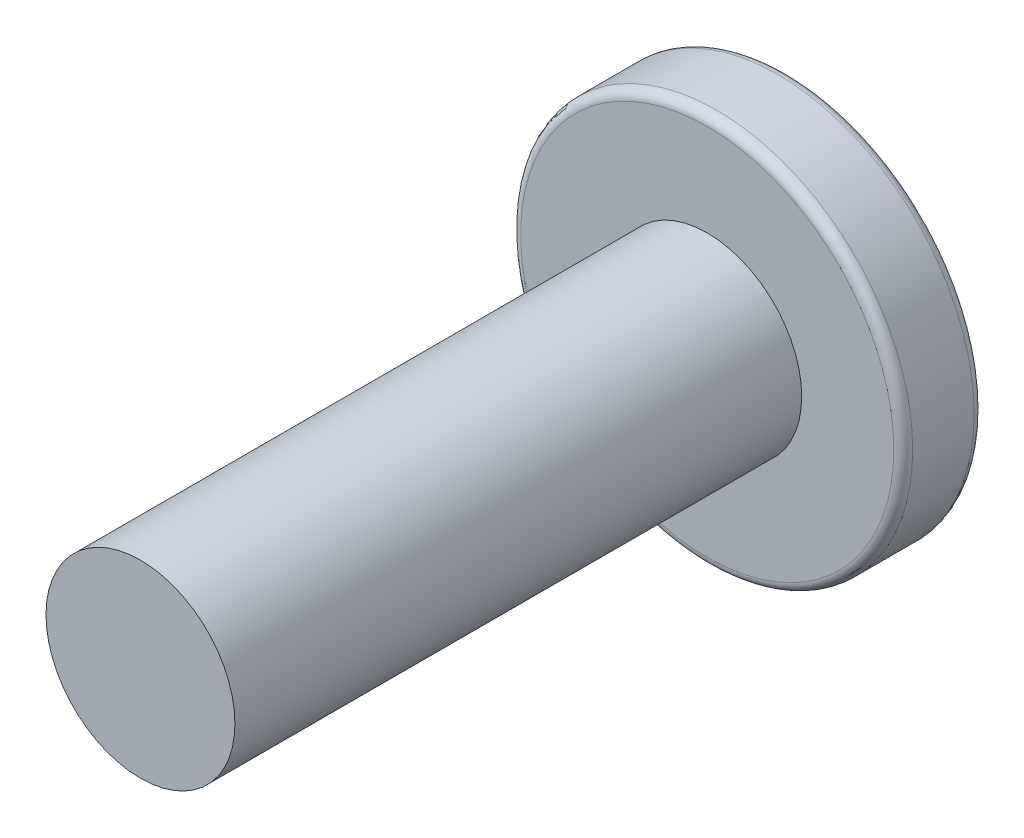
ISO-10303-21;
HEADER;
FILE_DESCRIPTION(('STEP AP214'),'2;1');
FILE_NAME('part.step','',(''),(''),'','','');
FILE_SCHEMA(('AUTOMOTIVE_DESIGN { 1 0 10303 214 1 1 1 1 }'));
ENDSEC;
DATA;
#1=APPLICATION_CONTEXT('core data for automotive mechanical design processes');
#2=APPLICATION_PROTOCOL_DEFINITION('international standard','automotive_design',2000,#1);
#3=PRODUCT_CONTEXT('',#1,'mechanical');
#4=PRODUCT('Part','Part','',(#3));
#5=PRODUCT_RELATED_PRODUCT_CATEGORY('part','',(#4));
#6=PRODUCT_DEFINITION_FORMATION('','',#4);
#7=PRODUCT_DEFINITION_CONTEXT('part definition',#1,'design');
#8=PRODUCT_DEFINITION('design','',#6,#7);
#9=PRODUCT_DEFINITION_SHAPE('','',#8);
#10=(LENGTH_UNIT() NAMED_UNIT(*) SI_UNIT(.MILLI.,.METRE.));
#11=(NAMED_UNIT(*) PLANE_ANGLE_UNIT() SI_UNIT($,.RADIAN.));
#12=(NAMED_UNIT(*) SI_UNIT($,.STERADIAN.) SOLID_ANGLE_UNIT());
#13=UNCERTAINTY_MEASURE_WITH_UNIT(LENGTH_MEASURE(1.E-05),#10,'distance_accuracy_value','');
#14=(GEOMETRIC_REPRESENTATION_CONTEXT(3) GLOBAL_UNCERTAINTY_ASSIGNED_CONTEXT((#13)) GLOBAL_UNIT_ASSIGNED_CONTEXT((#10,
#11,#12)) REPRESENTATION_CONTEXT('',''));
#15=CARTESIAN_POINT('',(0.,0.,0.));
#16=DIRECTION('',(0.,0.,1.));
#17=DIRECTION('',(1.,0.,0.));
#18=AXIS2_PLACEMENT_3D('',#15,#16,#17);
#19=CARTESIAN_POINT('',(0.,0.,1.7));
#20=DIRECTION('',(0.,0.,-1.));
#21=DIRECTION('',(-1.,0.,0.));
#22=AXIS2_PLACEMENT_3D('',#19,#20,#21);
#23=CYLINDRICAL_SURFACE('',#22,4.15);
#24=CARTESIAN_POINT('',(0.,0.,0.2));
#25=DIRECTION('',(0.,0.,1.));
#26=DIRECTION('',(1.,0.,0.));
#27=AXIS2_PLACEMENT_3D('',#24,#25,#26);
#28=CIRCLE('',#27,4.15);
#29=CARTESIAN_POINT('',(4.15,0.,0.2));
#30=VERTEX_POINT('',#29);
#31=EDGE_CURVE('E179',#30,#30,#28,.T.);
#32=ORIENTED_EDGE('',*,*,#31,.T.);
#33=EDGE_LOOP('',(#32));
#34=FACE_BOUND('',#33,.T.);
#35=CARTESIAN_POINT('',(0.,0.,1.5));
#36=DIRECTION('',(0.,0.,1.));
#37=DIRECTION('',(1.,0.,0.));
#38=AXIS2_PLACEMENT_3D('',#35,#36,#37);
#39=CIRCLE('',#38,4.15);
#40=CARTESIAN_POINT('',(4.15,0.,1.5));
#41=VERTEX_POINT('',#40);
#42=EDGE_CURVE('E175',#41,#41,#39,.F.);
#43=ORIENTED_EDGE('',*,*,#42,.T.);
#44=EDGE_LOOP('',(#43));
#45=FACE_BOUND('',#44,.T.);
#46=ADVANCED_FACE('F43',(#34,#45),#23,.T.);
#47=CARTESIAN_POINT('',(0.,0.,1.7));
#48=DIRECTION('',(0.,0.,1.));
#49=DIRECTION('',(1.,0.,0.));
#50=AXIS2_PLACEMENT_3D('',#47,#48,#49);
#51=PLANE('',#50);
#52=CARTESIAN_POINT('',(0.,0.,1.7));
#53=DIRECTION('',(0.,0.,1.));
#54=DIRECTION('',(1.,0.,0.));
#55=AXIS2_PLACEMENT_3D('',#52,#53,#54);
#56=CIRCLE('',#55,3.95);
#57=CARTESIAN_POINT('',(3.95,0.,1.7));
#58=VERTEX_POINT('',#57);
#59=EDGE_CURVE('E11',#58,#58,#56,.T.);
#60=ORIENTED_EDGE('',*,*,#59,.T.);
#61=EDGE_LOOP('',(#60));
#62=FACE_BOUND('',#61,.T.);
#63=CARTESIAN_POINT('',(0.,0.,1.7));
#64=DIRECTION('',(0.,0.,1.));
#65=DIRECTION('',(1.,0.,0.));
#66=AXIS2_PLACEMENT_3D('',#63,#64,#65);
#67=CIRCLE('',#66,2.);
#68=CARTESIAN_POINT('',(2.,0.,1.7));
#69=VERTEX_POINT('',#68);
#70=EDGE_CURVE('E171',#69,#69,#67,.T.);
#71=ORIENTED_EDGE('',*,*,#70,.F.);
#72=EDGE_LOOP('',(#71));
#73=FACE_BOUND('',#72,.T.);
#74=ADVANCED_FACE('F196',(#62,#73),#51,.T.);
#75=CARTESIAN_POINT('',(0.,0.,0.));
#76=DIRECTION('',(0.,0.,1.));
#77=DIRECTION('',(1.,0.,0.));
#78=AXIS2_PLACEMENT_3D('',#75,#76,#77);
#79=PLANE('',#78);
#80=DIRECTION('',(0.5,0.866025403784438,0.));
#81=VECTOR('',#80,1.);
#82=CARTESIAN_POINT('',(-1.15470053837925,0.,0.));
#83=LINE('',#82,#81);
#84=CARTESIAN_POINT('',(-1.15470053837925,0.,0.));
#85=VERTEX_POINT('',#84);
#86=CARTESIAN_POINT('',(-0.577350269189626,1.,0.));
#87=VERTEX_POINT('',#86);
#88=EDGE_CURVE('E139',#85,#87,#83,.T.);
#89=ORIENTED_EDGE('',*,*,#88,.F.);
#90=DIRECTION('',(-0.5,0.866025403784439,0.));
#91=VECTOR('',#90,1.);
#92=CARTESIAN_POINT('',(-0.577350269189626,-1.,0.));
#93=LINE('',#92,#91);
#94=CARTESIAN_POINT('',(-0.577350269189626,-1.,0.));
#95=VERTEX_POINT('',#94);
#96=EDGE_CURVE('E59',#95,#85,#93,.T.);
#97=ORIENTED_EDGE('',*,*,#96,.F.);
#98=DIRECTION('',(-1.,0.,0.));
#99=VECTOR('',#98,1.);
#100=CARTESIAN_POINT('',(0.577350269189626,-1.,0.));
#101=LINE('',#100,#99);
#102=CARTESIAN_POINT('',(0.577350269189626,-1.,0.));
#103=VERTEX_POINT('',#102);
#104=EDGE_CURVE('E152',#103,#95,#101,.T.);
#105=ORIENTED_EDGE('',*,*,#104,.F.);
#106=DIRECTION('',(-0.5,-0.866025403784438,0.));
#107=VECTOR('',#106,1.);
#108=CARTESIAN_POINT('',(1.15470053837925,0.,0.));
#109=LINE('',#108,#107);
#110=CARTESIAN_POINT('',(1.15470053837925,0.,0.));
#111=VERTEX_POINT('',#110);
#112=EDGE_CURVE('E149',#111,#103,#109,.T.);
#113=ORIENTED_EDGE('',*,*,#112,.F.);
#114=DIRECTION('',(0.5,-0.866025403784439,0.));
#115=VECTOR('',#114,1.);
#116=CARTESIAN_POINT('',(0.577350269189626,1.,0.));
#117=LINE('',#116,#115);
#118=CARTESIAN_POINT('',(0.577350269189626,1.,0.));
#119=VERTEX_POINT('',#118);
#120=EDGE_CURVE('E107',#119,#111,#117,.T.);
#121=ORIENTED_EDGE('',*,*,#120,.F.);
#122=DIRECTION('',(1.,0.,0.));
#123=VECTOR('',#122,1.);
#124=CARTESIAN_POINT('',(-0.577350269189626,1.,0.));
#125=LINE('',#124,#123);
#126=EDGE_CURVE('E143',#87,#119,#125,.T.);
#127=ORIENTED_EDGE('',*,*,#126,.F.);
#128=EDGE_LOOP('',(#89,#97,#105,#113,#121,#127));
#129=FACE_BOUND('',#128,.T.);
#130=CARTESIAN_POINT('',(0.,0.,0.));
#131=DIRECTION('',(0.,0.,1.));
#132=DIRECTION('',(1.,0.,0.));
#133=AXIS2_PLACEMENT_3D('',#130,#131,#132);
#134=CIRCLE('',#133,3.95);
#135=CARTESIAN_POINT('',(3.95,0.,0.));
#136=VERTEX_POINT('',#135);
#137=EDGE_CURVE('E52',#136,#136,#134,.F.);
#138=ORIENTED_EDGE('',*,*,#137,.T.);
#139=EDGE_LOOP('',(#138));
#140=FACE_BOUND('',#139,.T.);
#141=ADVANCED_FACE('F186',(#129,#140),#79,.F.);
#142=CARTESIAN_POINT('',(0.,0.,13.7));
#143=DIRECTION('',(0.,0.,-1.));
#144=DIRECTION('',(-1.,0.,0.));
#145=AXIS2_PLACEMENT_3D('',#142,#143,#144);
#146=CYLINDRICAL_SURFACE('',#145,2.);
#147=CARTESIAN_POINT('',(0.,0.,13.7));
#148=DIRECTION('',(0.,0.,1.));
#149=DIRECTION('',(1.,0.,0.));
#150=AXIS2_PLACEMENT_3D('',#147,#148,#149);
#151=CIRCLE('',#150,2.);
#152=CARTESIAN_POINT('',(2.,0.,13.7));
#153=VERTEX_POINT('',#152);
#154=EDGE_CURVE('E158',#153,#153,#151,.T.);
#155=ORIENTED_EDGE('',*,*,#154,.F.);
#156=EDGE_LOOP('',(#155));
#157=FACE_BOUND('',#156,.T.);
#158=ORIENTED_EDGE('',*,*,#70,.T.);
#159=EDGE_LOOP('',(#158));
#160=FACE_BOUND('',#159,.T.);
#161=ADVANCED_FACE('F210',(#157,#160),#146,.T.);
#162=CARTESIAN_POINT('',(0.,0.,13.7));
#163=DIRECTION('',(0.,0.,1.));
#164=DIRECTION('',(1.,0.,0.));
#165=AXIS2_PLACEMENT_3D('',#162,#163,#164);
#166=PLANE('',#165);
#167=ORIENTED_EDGE('',*,*,#154,.T.);
#168=EDGE_LOOP('',(#167));
#169=FACE_BOUND('',#168,.T.);
#170=ADVANCED_FACE('F191',(#169),#166,.T.);
#171=CARTESIAN_POINT('',(0.,0.,0.2));
#172=DIRECTION('',(0.,0.,1.));
#173=DIRECTION('',(1.,0.,0.));
#174=AXIS2_PLACEMENT_3D('',#171,#172,#173);
#175=TOROIDAL_SURFACE('',#174,3.95,0.2);
#176=ORIENTED_EDGE('',*,*,#137,.F.);
#177=EDGE_LOOP('',(#176));
#178=FACE_BOUND('',#177,.T.);
#179=ORIENTED_EDGE('',*,*,#31,.F.);
#180=EDGE_LOOP('',(#179));
#181=FACE_BOUND('',#180,.T.);
#182=ADVANCED_FACE('F188',(#178,#181),#175,.T.);
#183=CARTESIAN_POINT('',(0.,0.,1.5));
#184=DIRECTION('',(0.,0.,1.));
#185=DIRECTION('',(1.,0.,0.));
#186=AXIS2_PLACEMENT_3D('',#183,#184,#185);
#187=TOROIDAL_SURFACE('',#186,3.95,0.2);
#188=ORIENTED_EDGE('',*,*,#42,.F.);
#189=EDGE_LOOP('',(#188));
#190=FACE_BOUND('',#189,.T.);
#191=ORIENTED_EDGE('',*,*,#59,.F.);
#192=EDGE_LOOP('',(#191));
#193=FACE_BOUND('',#192,.T.);
#194=ADVANCED_FACE('F45',(#190,#193),#187,.T.);
#195=CARTESIAN_POINT('',(-0.577350269189626,-1.,1.5));
#196=DIRECTION('',(-0.866025403784439,-0.5,0.));
#197=DIRECTION('',(0.5,-0.866025403784439,0.));
#198=AXIS2_PLACEMENT_3D('',#195,#196,#197);
#199=PLANE('',#198);
#200=ORIENTED_EDGE('',*,*,#96,.T.);
#201=DIRECTION('',(0.,0.,-1.));
#202=VECTOR('',#201,1.);
#203=CARTESIAN_POINT('',(-1.15470053837925,0.,1.5));
#204=LINE('',#203,#202);
#205=CARTESIAN_POINT('',(-1.15470053837925,0.,1.5));
#206=VERTEX_POINT('',#205);
#207=EDGE_CURVE('E89',#206,#85,#204,.T.);
#208=ORIENTED_EDGE('',*,*,#207,.F.);
#209=DIRECTION('',(-0.5,0.866025403784439,0.));
#210=VECTOR('',#209,1.);
#211=CARTESIAN_POINT('',(-0.577350269189626,-1.,1.5));
#212=LINE('',#211,#210);
#213=CARTESIAN_POINT('',(-0.577350269189626,-1.,1.5));
#214=VERTEX_POINT('',#213);
#215=EDGE_CURVE('E155',#214,#206,#212,.T.);
#216=ORIENTED_EDGE('',*,*,#215,.F.);
#217=DIRECTION('',(0.,0.,-1.));
#218=VECTOR('',#217,1.);
#219=CARTESIAN_POINT('',(-0.577350269189626,-1.,1.5));
#220=LINE('',#219,#218);
#221=EDGE_CURVE('E67',#214,#95,#220,.T.);
#222=ORIENTED_EDGE('',*,*,#221,.T.);
#223=EDGE_LOOP('',(#200,#208,#216,#222));
#224=FACE_BOUND('',#223,.T.);
#225=ADVANCED_FACE('F202',(#224),#199,.F.);
#226=CARTESIAN_POINT('',(0.577350269189626,-1.,1.5));
#227=DIRECTION('',(0.,-1.,0.));
#228=DIRECTION('',(0.,0.,-1.));
#229=AXIS2_PLACEMENT_3D('',#226,#227,#228);
#230=PLANE('',#229);
#231=ORIENTED_EDGE('',*,*,#104,.T.);
#232=ORIENTED_EDGE('',*,*,#221,.F.);
#233=DIRECTION('',(-1.,0.,0.));
#234=VECTOR('',#233,1.);
#235=CARTESIAN_POINT('',(0.577350269189626,-1.,1.5));
#236=LINE('',#235,#234);
#237=CARTESIAN_POINT('',(0.577350269189626,-1.,1.5));
#238=VERTEX_POINT('',#237);
#239=EDGE_CURVE('E121',#238,#214,#236,.T.);
#240=ORIENTED_EDGE('',*,*,#239,.F.);
#241=DIRECTION('',(0.,0.,-1.));
#242=VECTOR('',#241,1.);
#243=CARTESIAN_POINT('',(0.577350269189626,-1.,1.5));
#244=LINE('',#243,#242);
#245=EDGE_CURVE('E112',#238,#103,#244,.T.);
#246=ORIENTED_EDGE('',*,*,#245,.T.);
#247=EDGE_LOOP('',(#231,#232,#240,#246));
#248=FACE_BOUND('',#247,.T.);
#249=ADVANCED_FACE('F226',(#248),#230,.F.);
#250=CARTESIAN_POINT('',(1.15470053837925,0.,1.5));
#251=DIRECTION('',(0.866025403784439,-0.5,0.));
#252=DIRECTION('',(0.5,0.866025403784439,0.));
#253=AXIS2_PLACEMENT_3D('',#250,#251,#252);
#254=PLANE('',#253);
#255=ORIENTED_EDGE('',*,*,#112,.T.);
#256=ORIENTED_EDGE('',*,*,#245,.F.);
#257=DIRECTION('',(-0.5,-0.866025403784438,0.));
#258=VECTOR('',#257,1.);
#259=CARTESIAN_POINT('',(1.15470053837925,0.,1.5));
#260=LINE('',#259,#258);
#261=CARTESIAN_POINT('',(1.15470053837925,0.,1.5));
#262=VERTEX_POINT('',#261);
#263=EDGE_CURVE('E116',#262,#238,#260,.T.);
#264=ORIENTED_EDGE('',*,*,#263,.F.);
#265=DIRECTION('',(0.,0.,-1.));
#266=VECTOR('',#265,1.);
#267=CARTESIAN_POINT('',(1.15470053837925,0.,1.5));
#268=LINE('',#267,#266);
#269=EDGE_CURVE('E100',#262,#111,#268,.T.);
#270=ORIENTED_EDGE('',*,*,#269,.T.);
#271=EDGE_LOOP('',(#255,#256,#264,#270));
#272=FACE_BOUND('',#271,.T.);
#273=ADVANCED_FACE('F117',(#272),#254,.F.);
#274=CARTESIAN_POINT('',(0.577350269189626,1.,1.5));
#275=DIRECTION('',(0.866025403784439,0.5,0.));
#276=DIRECTION('',(-0.5,0.866025403784439,0.));
#277=AXIS2_PLACEMENT_3D('',#274,#275,#276);
#278=PLANE('',#277);
#279=ORIENTED_EDGE('',*,*,#120,.T.);
#280=ORIENTED_EDGE('',*,*,#269,.F.);
#281=DIRECTION('',(0.5,-0.866025403784439,0.));
#282=VECTOR('',#281,1.);
#283=CARTESIAN_POINT('',(0.577350269189626,1.,1.5));
#284=LINE('',#283,#282);
#285=CARTESIAN_POINT('',(0.577350269189626,1.,1.5));
#286=VERTEX_POINT('',#285);
#287=EDGE_CURVE('E104',#286,#262,#284,.T.);
#288=ORIENTED_EDGE('',*,*,#287,.F.);
#289=DIRECTION('',(0.,0.,-1.));
#290=VECTOR('',#289,1.);
#291=CARTESIAN_POINT('',(0.577350269189626,1.,1.5));
#292=LINE('',#291,#290);
#293=EDGE_CURVE('E113',#286,#119,#292,.T.);
#294=ORIENTED_EDGE('',*,*,#293,.T.);
#295=EDGE_LOOP('',(#279,#280,#288,#294));
#296=FACE_BOUND('',#295,.T.);
#297=ADVANCED_FACE('F102',(#296),#278,.F.);
#298=CARTESIAN_POINT('',(-0.577350269189626,1.,1.5));
#299=DIRECTION('',(0.,1.,0.));
#300=DIRECTION('',(0.,0.,1.));
#301=AXIS2_PLACEMENT_3D('',#298,#299,#300);
#302=PLANE('',#301);
#303=ORIENTED_EDGE('',*,*,#126,.T.);
#304=ORIENTED_EDGE('',*,*,#293,.F.);
#305=DIRECTION('',(1.,0.,0.));
#306=VECTOR('',#305,1.);
#307=CARTESIAN_POINT('',(-0.577350269189626,1.,1.5));
#308=LINE('',#307,#306);
#309=CARTESIAN_POINT('',(-0.577350269189626,1.,1.5));
#310=VERTEX_POINT('',#309);
#311=EDGE_CURVE('E127',#310,#286,#308,.T.);
#312=ORIENTED_EDGE('',*,*,#311,.F.);
#313=DIRECTION('',(0.,0.,-1.));
#314=VECTOR('',#313,1.);
#315=CARTESIAN_POINT('',(-0.577350269189626,1.,1.5));
#316=LINE('',#315,#314);
#317=EDGE_CURVE('E163',#310,#87,#316,.T.);
#318=ORIENTED_EDGE('',*,*,#317,.T.);
#319=EDGE_LOOP('',(#303,#304,#312,#318));
#320=FACE_BOUND('',#319,.T.);
#321=ADVANCED_FACE('F230',(#320),#302,.F.);
#322=CARTESIAN_POINT('',(-1.15470053837925,0.,1.5));
#323=DIRECTION('',(-0.866025403784439,0.5,0.));
#324=DIRECTION('',(-0.5,-0.866025403784439,0.));
#325=AXIS2_PLACEMENT_3D('',#322,#323,#324);
#326=PLANE('',#325);
#327=ORIENTED_EDGE('',*,*,#88,.T.);
#328=ORIENTED_EDGE('',*,*,#317,.F.);
#329=DIRECTION('',(0.5,0.866025403784438,0.));
#330=VECTOR('',#329,1.);
#331=CARTESIAN_POINT('',(-1.15470053837925,0.,1.5));
#332=LINE('',#331,#330);
#333=EDGE_CURVE('E131',#206,#310,#332,.T.);
#334=ORIENTED_EDGE('',*,*,#333,.F.);
#335=ORIENTED_EDGE('',*,*,#207,.T.);
#336=EDGE_LOOP('',(#327,#328,#334,#335));
#337=FACE_BOUND('',#336,.T.);
#338=ADVANCED_FACE('F227',(#337),#326,.F.);
#339=CARTESIAN_POINT('',(0.,0.,1.5));
#340=DIRECTION('',(0.,0.,-1.));
#341=DIRECTION('',(-1.,0.,0.));
#342=AXIS2_PLACEMENT_3D('',#339,#340,#341);
#343=PLANE('',#342);
#344=ORIENTED_EDGE('',*,*,#215,.T.);
#345=ORIENTED_EDGE('',*,*,#333,.T.);
#346=ORIENTED_EDGE('',*,*,#311,.T.);
#347=ORIENTED_EDGE('',*,*,#287,.T.);
#348=ORIENTED_EDGE('',*,*,#263,.T.);
#349=ORIENTED_EDGE('',*,*,#239,.T.);
#350=EDGE_LOOP('',(#344,#345,#346,#347,#348,#349));
#351=FACE_BOUND('',#350,.T.);
#352=ADVANCED_FACE('F124',(#351),#343,.T.);
#353=CLOSED_SHELL('',(#46,#74,#141,#161,#170,#182,#194,#225,#249,#273,#297,#321,#338,#352));
#354=MANIFOLD_SOLID_BREP('B2',#353);
#355=ADVANCED_BREP_SHAPE_REPRESENTATION('',(#18,#354),#14);
#356=SHAPE_DEFINITION_REPRESENTATION(#9,#355);
ENDSEC;
END-ISO-10303-21;
